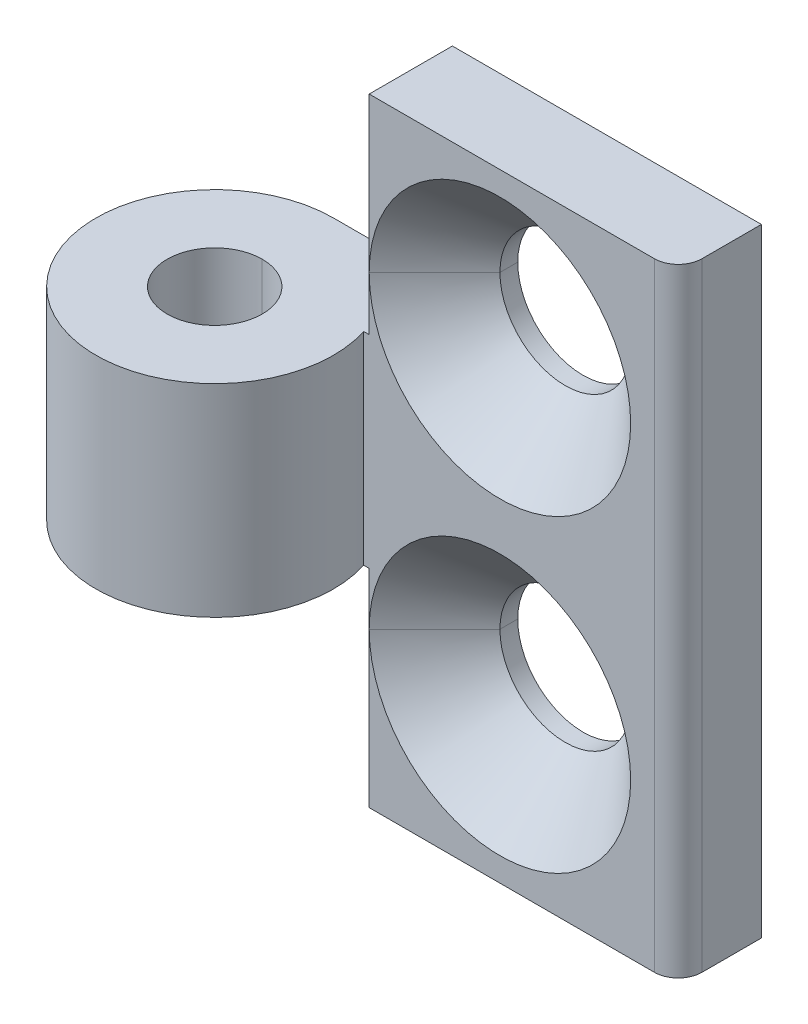
ISO-10303-21;
HEADER;
FILE_DESCRIPTION(('STEP AP214'),'2;1');
FILE_NAME('part.step','',(''),(''),'','','');
FILE_SCHEMA(('AUTOMOTIVE_DESIGN { 1 0 10303 214 1 1 1 1 }'));
ENDSEC;
DATA;
#1=APPLICATION_CONTEXT('core data for automotive mechanical design processes');
#2=APPLICATION_PROTOCOL_DEFINITION('international standard','automotive_design',2000,#1);
#3=PRODUCT_CONTEXT('',#1,'mechanical');
#4=PRODUCT('Part','Part','',(#3));
#5=PRODUCT_RELATED_PRODUCT_CATEGORY('part','',(#4));
#6=PRODUCT_DEFINITION_FORMATION('','',#4);
#7=PRODUCT_DEFINITION_CONTEXT('part definition',#1,'design');
#8=PRODUCT_DEFINITION('design','',#6,#7);
#9=PRODUCT_DEFINITION_SHAPE('','',#8);
#10=(LENGTH_UNIT() NAMED_UNIT(*) SI_UNIT(.MILLI.,.METRE.));
#11=(NAMED_UNIT(*) PLANE_ANGLE_UNIT() SI_UNIT($,.RADIAN.));
#12=(NAMED_UNIT(*) SI_UNIT($,.STERADIAN.) SOLID_ANGLE_UNIT());
#13=UNCERTAINTY_MEASURE_WITH_UNIT(LENGTH_MEASURE(1.E-05),#10,'distance_accuracy_value','');
#14=(GEOMETRIC_REPRESENTATION_CONTEXT(3) GLOBAL_UNCERTAINTY_ASSIGNED_CONTEXT((#13)) GLOBAL_UNIT_ASSIGNED_CONTEXT((#10,
#11,#12)) REPRESENTATION_CONTEXT('',''));
#15=CARTESIAN_POINT('',(0.,0.,0.));
#16=DIRECTION('',(0.,0.,1.));
#17=DIRECTION('',(1.,0.,0.));
#18=AXIS2_PLACEMENT_3D('',#15,#16,#17);
#19=CARTESIAN_POINT('',(0.,0.,-1.5));
#20=DIRECTION('',(0.,0.,1.));
#21=DIRECTION('',(1.,0.,0.));
#22=AXIS2_PLACEMENT_3D('',#19,#20,#21);
#23=PLANE('',#22);
#24=CARTESIAN_POINT('',(10.5,6.5,-1.5));
#25=DIRECTION('',(0.,0.,1.));
#26=DIRECTION('',(1.,0.,0.));
#27=AXIS2_PLACEMENT_3D('',#24,#25,#26);
#28=CIRCLE('',#27,5.5);
#29=CARTESIAN_POINT('',(16.,6.5,-1.5));
#30=VERTEX_POINT('',#29);
#31=CARTESIAN_POINT('',(5.,6.5,-1.5));
#32=VERTEX_POINT('',#31);
#33=EDGE_CURVE('E11',#30,#32,#28,.T.);
#34=ORIENTED_EDGE('',*,*,#33,.F.);
#35=CARTESIAN_POINT('',(10.5,6.5,-1.5));
#36=DIRECTION('',(0.,0.,1.));
#37=DIRECTION('',(1.,0.,0.));
#38=AXIS2_PLACEMENT_3D('',#35,#36,#37);
#39=CIRCLE('',#38,5.5);
#40=EDGE_CURVE('E25',#32,#30,#39,.T.);
#41=ORIENTED_EDGE('',*,*,#40,.F.);
#42=DIRECTION('',(0.,1.,0.));
#43=VECTOR('',#42,1.);
#44=CARTESIAN_POINT('',(5.,0.,-1.5));
#45=LINE('',#44,#43);
#46=CARTESIAN_POINT('',(5.,4.2333333333333,-1.5));
#47=VERTEX_POINT('',#46);
#48=EDGE_CURVE('E386',#47,#32,#45,.T.);
#49=ORIENTED_EDGE('',*,*,#48,.F.);
#50=DIRECTION('',(1.,0.,0.));
#51=VECTOR('',#50,1.);
#52=CARTESIAN_POINT('',(0.,4.2333333333333,-1.5));
#53=LINE('',#52,#51);
#54=CARTESIAN_POINT('',(4.76969600708473,4.2333333333333,-1.5));
#55=VERTEX_POINT('',#54);
#56=EDGE_CURVE('E381',#55,#47,#53,.T.);
#57=ORIENTED_EDGE('',*,*,#56,.F.);
#58=DIRECTION('',(0.,1.,0.));
#59=VECTOR('',#58,1.);
#60=CARTESIAN_POINT('',(4.76969600708473,-13.,-1.5));
#61=LINE('',#60,#59);
#62=CARTESIAN_POINT('',(4.76969600708473,-4.2833333333333,-1.5));
#63=VERTEX_POINT('',#62);
#64=EDGE_CURVE('E376',#63,#55,#61,.T.);
#65=ORIENTED_EDGE('',*,*,#64,.F.);
#66=DIRECTION('',(-1.,0.,0.));
#67=VECTOR('',#66,1.);
#68=CARTESIAN_POINT('',(0.,-4.2833333333333,-1.5));
#69=LINE('',#68,#67);
#70=CARTESIAN_POINT('',(5.,-4.2833333333333,-1.5));
#71=VERTEX_POINT('',#70);
#72=EDGE_CURVE('E371',#71,#63,#69,.T.);
#73=ORIENTED_EDGE('',*,*,#72,.F.);
#74=DIRECTION('',(0.,1.,0.));
#75=VECTOR('',#74,1.);
#76=CARTESIAN_POINT('',(5.,0.,-1.5));
#77=LINE('',#76,#75);
#78=CARTESIAN_POINT('',(5.,-6.5,-1.5));
#79=VERTEX_POINT('',#78);
#80=EDGE_CURVE('E366',#79,#71,#77,.T.);
#81=ORIENTED_EDGE('',*,*,#80,.F.);
#82=CARTESIAN_POINT('',(10.5,-6.5,-1.5));
#83=DIRECTION('',(0.,0.,1.));
#84=DIRECTION('',(1.,0.,0.));
#85=AXIS2_PLACEMENT_3D('',#82,#83,#84);
#86=CIRCLE('',#85,5.5);
#87=CARTESIAN_POINT('',(16.,-6.5,-1.5));
#88=VERTEX_POINT('',#87);
#89=EDGE_CURVE('E362',#88,#79,#86,.T.);
#90=ORIENTED_EDGE('',*,*,#89,.F.);
#91=CARTESIAN_POINT('',(10.5,-6.5,-1.5));
#92=DIRECTION('',(0.,0.,1.));
#93=DIRECTION('',(1.,0.,0.));
#94=AXIS2_PLACEMENT_3D('',#91,#92,#93);
#95=CIRCLE('',#94,5.5);
#96=EDGE_CURVE('E151',#79,#88,#95,.T.);
#97=ORIENTED_EDGE('',*,*,#96,.F.);
#98=DIRECTION('',(0.,1.,0.));
#99=VECTOR('',#98,1.);
#100=CARTESIAN_POINT('',(5.,0.,-1.5));
#101=LINE('',#100,#99);
#102=CARTESIAN_POINT('',(5.,-13.,-1.5));
#103=VERTEX_POINT('',#102);
#104=EDGE_CURVE('E354',#103,#79,#101,.T.);
#105=ORIENTED_EDGE('',*,*,#104,.F.);
#106=DIRECTION('',(1.,0.,0.));
#107=VECTOR('',#106,1.);
#108=CARTESIAN_POINT('',(0.,-13.,-1.5));
#109=LINE('',#108,#107);
#110=CARTESIAN_POINT('',(17.,-13.,-1.5));
#111=VERTEX_POINT('',#110);
#112=EDGE_CURVE('E350',#103,#111,#109,.T.);
#113=ORIENTED_EDGE('',*,*,#112,.T.);
#114=DIRECTION('',(0.,-1.,0.));
#115=VECTOR('',#114,1.);
#116=CARTESIAN_POINT('',(17.,13.,-1.5));
#117=LINE('',#116,#115);
#118=CARTESIAN_POINT('',(17.,13.,-1.5));
#119=VERTEX_POINT('',#118);
#120=EDGE_CURVE('E345',#119,#111,#117,.T.);
#121=ORIENTED_EDGE('',*,*,#120,.F.);
#122=DIRECTION('',(-1.,0.,0.));
#123=VECTOR('',#122,1.);
#124=CARTESIAN_POINT('',(18.,13.,-1.5));
#125=LINE('',#124,#123);
#126=CARTESIAN_POINT('',(5.,13.,-1.5));
#127=VERTEX_POINT('',#126);
#128=EDGE_CURVE('E341',#119,#127,#125,.T.);
#129=ORIENTED_EDGE('',*,*,#128,.T.);
#130=DIRECTION('',(0.,1.,0.));
#131=VECTOR('',#130,1.);
#132=CARTESIAN_POINT('',(5.,0.,-1.5));
#133=LINE('',#132,#131);
#134=EDGE_CURVE('E336',#32,#127,#133,.T.);
#135=ORIENTED_EDGE('',*,*,#134,.F.);
#136=EDGE_LOOP('',(#34,#41,#49,#57,#65,#73,#81,#90,#97,#105,#113,#121,#129,#135));
#137=FACE_BOUND('',#136,.T.);
#138=ADVANCED_FACE('F17',(#137),#23,.T.);
#139=CARTESIAN_POINT('',(5.,-4.2833333333333,21.));
#140=DIRECTION('',(1.,0.,0.));
#141=DIRECTION('',(0.,0.,-1.));
#142=AXIS2_PLACEMENT_3D('',#139,#140,#141);
#143=PLANE('',#142);
#144=ORIENTED_EDGE('',*,*,#104,.T.);
#145=ORIENTED_EDGE('',*,*,#80,.T.);
#146=DIRECTION('',(0.,0.,-1.));
#147=VECTOR('',#146,1.);
#148=CARTESIAN_POINT('',(5.,-4.2833333333333,21.));
#149=LINE('',#148,#147);
#150=CARTESIAN_POINT('',(5.,-4.2833333333333,-5.));
#151=VERTEX_POINT('',#150);
#152=EDGE_CURVE('E332',#71,#151,#149,.T.);
#153=ORIENTED_EDGE('',*,*,#152,.T.);
#154=DIRECTION('',(0.,-1.,0.));
#155=VECTOR('',#154,1.);
#156=CARTESIAN_POINT('',(5.,-4.2833333333333,-5.));
#157=LINE('',#156,#155);
#158=CARTESIAN_POINT('',(5.,-13.,-5.));
#159=VERTEX_POINT('',#158);
#160=EDGE_CURVE('E328',#151,#159,#157,.T.);
#161=ORIENTED_EDGE('',*,*,#160,.T.);
#162=DIRECTION('',(0.,0.,-1.));
#163=VECTOR('',#162,1.);
#164=CARTESIAN_POINT('',(5.,-13.,21.));
#165=LINE('',#164,#163);
#166=EDGE_CURVE('E323',#103,#159,#165,.T.);
#167=ORIENTED_EDGE('',*,*,#166,.F.);
#168=EDGE_LOOP('',(#144,#145,#153,#161,#167));
#169=FACE_BOUND('',#168,.T.);
#170=ADVANCED_FACE('F418',(#169),#143,.F.);
#171=CARTESIAN_POINT('',(5.,-13.,0.));
#172=DIRECTION('',(0.,1.,0.));
#173=DIRECTION('',(0.,0.,1.));
#174=AXIS2_PLACEMENT_3D('',#171,#172,#173);
#175=PLANE('',#174);
#176=DIRECTION('',(0.,0.,-1.));
#177=VECTOR('',#176,1.);
#178=CARTESIAN_POINT('',(18.,-13.,-1.5));
#179=LINE('',#178,#177);
#180=CARTESIAN_POINT('',(18.,-13.,-2.5));
#181=VERTEX_POINT('',#180);
#182=CARTESIAN_POINT('',(18.,-13.,-5.));
#183=VERTEX_POINT('',#182);
#184=EDGE_CURVE('E318',#181,#183,#179,.T.);
#185=ORIENTED_EDGE('',*,*,#184,.F.);
#186=CARTESIAN_POINT('',(17.0000000000007,-13.,-2.49999999999931));
#187=DIRECTION('',(0.,1.,0.));
#188=DIRECTION('',(1.,0.,0.));
#189=AXIS2_PLACEMENT_3D('',#186,#187,#188);
#190=CIRCLE('',#189,0.99999999999931);
#191=EDGE_CURVE('E313',#111,#181,#190,.T.);
#192=ORIENTED_EDGE('',*,*,#191,.F.);
#193=ORIENTED_EDGE('',*,*,#112,.F.);
#194=ORIENTED_EDGE('',*,*,#166,.T.);
#195=DIRECTION('',(1.,0.,0.));
#196=VECTOR('',#195,1.);
#197=CARTESIAN_POINT('',(0.,-13.,-5.));
#198=LINE('',#197,#196);
#199=EDGE_CURVE('E309',#159,#183,#198,.T.);
#200=ORIENTED_EDGE('',*,*,#199,.T.);
#201=EDGE_LOOP('',(#185,#192,#193,#194,#200));
#202=FACE_BOUND('',#201,.T.);
#203=ADVANCED_FACE('F429',(#202),#175,.F.);
#204=CARTESIAN_POINT('',(0.,0.,-5.));
#205=DIRECTION('',(0.,0.,1.));
#206=DIRECTION('',(1.,0.,0.));
#207=AXIS2_PLACEMENT_3D('',#204,#205,#206);
#208=PLANE('',#207);
#209=CARTESIAN_POINT('',(10.5,-6.5,-5.));
#210=DIRECTION('',(0.,0.,1.));
#211=DIRECTION('',(1.,0.,0.));
#212=AXIS2_PLACEMENT_3D('',#209,#210,#211);
#213=CIRCLE('',#212,2.75);
#214=CARTESIAN_POINT('',(13.25,-6.5,-5.));
#215=VERTEX_POINT('',#214);
#216=CARTESIAN_POINT('',(7.75,-6.5,-5.));
#217=VERTEX_POINT('',#216);
#218=EDGE_CURVE('E163',#215,#217,#213,.T.);
#219=ORIENTED_EDGE('',*,*,#218,.T.);
#220=CARTESIAN_POINT('',(10.5,-6.5,-5.));
#221=DIRECTION('',(0.,0.,1.));
#222=DIRECTION('',(1.,0.,0.));
#223=AXIS2_PLACEMENT_3D('',#220,#221,#222);
#224=CIRCLE('',#223,2.75);
#225=EDGE_CURVE('E302',#217,#215,#224,.T.);
#226=ORIENTED_EDGE('',*,*,#225,.T.);
#227=EDGE_LOOP('',(#219,#226));
#228=FACE_BOUND('',#227,.T.);
#229=CARTESIAN_POINT('',(10.5,6.5,-5.));
#230=DIRECTION('',(0.,0.,1.));
#231=DIRECTION('',(1.,0.,0.));
#232=AXIS2_PLACEMENT_3D('',#229,#230,#231);
#233=CIRCLE('',#232,2.75);
#234=CARTESIAN_POINT('',(13.25,6.5,-5.));
#235=VERTEX_POINT('',#234);
#236=CARTESIAN_POINT('',(7.75,6.5,-5.));
#237=VERTEX_POINT('',#236);
#238=EDGE_CURVE('E298',#235,#237,#233,.T.);
#239=ORIENTED_EDGE('',*,*,#238,.T.);
#240=CARTESIAN_POINT('',(10.5,6.5,-5.));
#241=DIRECTION('',(0.,0.,1.));
#242=DIRECTION('',(1.,0.,0.));
#243=AXIS2_PLACEMENT_3D('',#240,#241,#242);
#244=CIRCLE('',#243,2.75);
#245=EDGE_CURVE('E294',#237,#235,#244,.T.);
#246=ORIENTED_EDGE('',*,*,#245,.T.);
#247=EDGE_LOOP('',(#239,#246));
#248=FACE_BOUND('',#247,.T.);
#249=DIRECTION('',(0.,-1.,0.));
#250=VECTOR('',#249,1.);
#251=CARTESIAN_POINT('',(0.,13.,-5.));
#252=LINE('',#251,#250);
#253=CARTESIAN_POINT('',(0.,4.2333333333333,-5.));
#254=VERTEX_POINT('',#253);
#255=CARTESIAN_POINT('',(0.,-4.2833333333333,-5.));
#256=VERTEX_POINT('',#255);
#257=EDGE_CURVE('E289',#254,#256,#252,.T.);
#258=ORIENTED_EDGE('',*,*,#257,.F.);
#259=DIRECTION('',(-1.,0.,0.));
#260=VECTOR('',#259,1.);
#261=CARTESIAN_POINT('',(5.,4.2333333333333,-5.));
#262=LINE('',#261,#260);
#263=CARTESIAN_POINT('',(5.,4.2333333333333,-5.));
#264=VERTEX_POINT('',#263);
#265=EDGE_CURVE('E284',#264,#254,#262,.T.);
#266=ORIENTED_EDGE('',*,*,#265,.F.);
#267=DIRECTION('',(0.,-1.,0.));
#268=VECTOR('',#267,1.);
#269=CARTESIAN_POINT('',(5.,13.,-5.));
#270=LINE('',#269,#268);
#271=CARTESIAN_POINT('',(5.,13.,-5.));
#272=VERTEX_POINT('',#271);
#273=EDGE_CURVE('E279',#272,#264,#270,.T.);
#274=ORIENTED_EDGE('',*,*,#273,.F.);
#275=DIRECTION('',(-1.,0.,0.));
#276=VECTOR('',#275,1.);
#277=CARTESIAN_POINT('',(18.,13.,-5.));
#278=LINE('',#277,#276);
#279=CARTESIAN_POINT('',(18.,13.,-5.));
#280=VERTEX_POINT('',#279);
#281=EDGE_CURVE('E274',#280,#272,#278,.T.);
#282=ORIENTED_EDGE('',*,*,#281,.F.);
#283=DIRECTION('',(0.,1.,0.));
#284=VECTOR('',#283,1.);
#285=CARTESIAN_POINT('',(18.,-13.,-5.));
#286=LINE('',#285,#284);
#287=EDGE_CURVE('E269',#183,#280,#286,.T.);
#288=ORIENTED_EDGE('',*,*,#287,.F.);
#289=ORIENTED_EDGE('',*,*,#199,.F.);
#290=ORIENTED_EDGE('',*,*,#160,.F.);
#291=DIRECTION('',(1.,0.,0.));
#292=VECTOR('',#291,1.);
#293=CARTESIAN_POINT('',(-5.,-4.2833333333333,-5.));
#294=LINE('',#293,#292);
#295=EDGE_CURVE('E264',#256,#151,#294,.T.);
#296=ORIENTED_EDGE('',*,*,#295,.F.);
#297=EDGE_LOOP('',(#258,#266,#274,#282,#288,#289,#290,#296));
#298=FACE_BOUND('',#297,.T.);
#299=ADVANCED_FACE('F439',(#228,#248,#298),#208,.F.);
#300=CARTESIAN_POINT('',(-5.,-4.2833333333333,21.));
#301=DIRECTION('',(0.,1.,0.));
#302=DIRECTION('',(0.,0.,1.));
#303=AXIS2_PLACEMENT_3D('',#300,#301,#302);
#304=PLANE('',#303);
#305=CARTESIAN_POINT('',(0.,-4.2833333333333,0.));
#306=DIRECTION('',(0.,-1.,0.));
#307=DIRECTION('',(0.,0.,1.));
#308=AXIS2_PLACEMENT_3D('',#305,#306,#307);
#309=CIRCLE('',#308,2.);
#310=CARTESIAN_POINT('',(0.,-4.2833333333333,-2.));
#311=VERTEX_POINT('',#310);
#312=CARTESIAN_POINT('',(0.,-4.2833333333333,2.));
#313=VERTEX_POINT('',#312);
#314=EDGE_CURVE('E259',#311,#313,#309,.T.);
#315=ORIENTED_EDGE('',*,*,#314,.F.);
#316=CARTESIAN_POINT('',(0.,-4.2833333333333,0.));
#317=DIRECTION('',(0.,-1.,0.));
#318=DIRECTION('',(0.,0.,1.));
#319=AXIS2_PLACEMENT_3D('',#316,#317,#318);
#320=CIRCLE('',#319,2.);
#321=EDGE_CURVE('E254',#313,#311,#320,.T.);
#322=ORIENTED_EDGE('',*,*,#321,.F.);
#323=EDGE_LOOP('',(#315,#322));
#324=FACE_BOUND('',#323,.T.);
#325=ORIENTED_EDGE('',*,*,#295,.T.);
#326=ORIENTED_EDGE('',*,*,#152,.F.);
#327=ORIENTED_EDGE('',*,*,#72,.T.);
#328=CARTESIAN_POINT('',(0.,-4.2833333333333,0.));
#329=DIRECTION('',(0.,1.,0.));
#330=DIRECTION('',(0.,0.,1.));
#331=AXIS2_PLACEMENT_3D('',#328,#329,#330);
#332=CIRCLE('',#331,5.);
#333=EDGE_CURVE('E249',#256,#63,#332,.T.);
#334=ORIENTED_EDGE('',*,*,#333,.F.);
#335=EDGE_LOOP('',(#325,#326,#327,#334));
#336=FACE_BOUND('',#335,.T.);
#337=ADVANCED_FACE('F415',(#324,#336),#304,.F.);
#338=CARTESIAN_POINT('',(0.,-13.,0.));
#339=DIRECTION('',(0.,-1.,0.));
#340=DIRECTION('',(0.591607972515193,0.,-0.806225779082053));
#341=AXIS2_PLACEMENT_3D('',#338,#339,#340);
#342=CYLINDRICAL_SURFACE('',#341,5.);
#343=ORIENTED_EDGE('',*,*,#257,.T.);
#344=ORIENTED_EDGE('',*,*,#333,.T.);
#345=ORIENTED_EDGE('',*,*,#64,.T.);
#346=CARTESIAN_POINT('',(0.,4.2333333333333,0.));
#347=DIRECTION('',(0.,-1.,0.));
#348=DIRECTION('',(0.,0.,-1.));
#349=AXIS2_PLACEMENT_3D('',#346,#347,#348);
#350=CIRCLE('',#349,5.);
#351=EDGE_CURVE('E244',#55,#254,#350,.T.);
#352=ORIENTED_EDGE('',*,*,#351,.T.);
#353=EDGE_LOOP('',(#343,#344,#345,#352));
#354=FACE_BOUND('',#353,.T.);
#355=ADVANCED_FACE('F411',(#354),#342,.T.);
#356=CARTESIAN_POINT('',(5.,4.2333333333333,21.));
#357=DIRECTION('',(0.,-1.,0.));
#358=DIRECTION('',(0.,0.,-1.));
#359=AXIS2_PLACEMENT_3D('',#356,#357,#358);
#360=PLANE('',#359);
#361=CARTESIAN_POINT('',(0.,4.2333333333333,0.));
#362=DIRECTION('',(0.,1.,0.));
#363=DIRECTION('',(0.,0.,-1.));
#364=AXIS2_PLACEMENT_3D('',#361,#362,#363);
#365=CIRCLE('',#364,2.);
#366=CARTESIAN_POINT('',(0.,4.2333333333333,2.));
#367=VERTEX_POINT('',#366);
#368=CARTESIAN_POINT('',(0.,4.2333333333333,-2.));
#369=VERTEX_POINT('',#368);
#370=EDGE_CURVE('E239',#367,#369,#365,.T.);
#371=ORIENTED_EDGE('',*,*,#370,.F.);
#372=CARTESIAN_POINT('',(0.,4.2333333333333,0.));
#373=DIRECTION('',(0.,1.,0.));
#374=DIRECTION('',(0.,0.,-1.));
#375=AXIS2_PLACEMENT_3D('',#372,#373,#374);
#376=CIRCLE('',#375,2.);
#377=EDGE_CURVE('E234',#369,#367,#376,.T.);
#378=ORIENTED_EDGE('',*,*,#377,.F.);
#379=EDGE_LOOP('',(#371,#378));
#380=FACE_BOUND('',#379,.T.);
#381=ORIENTED_EDGE('',*,*,#351,.F.);
#382=ORIENTED_EDGE('',*,*,#56,.T.);
#383=DIRECTION('',(0.,0.,-1.));
#384=VECTOR('',#383,1.);
#385=CARTESIAN_POINT('',(5.,4.2333333333333,21.));
#386=LINE('',#385,#384);
#387=EDGE_CURVE('E229',#47,#264,#386,.T.);
#388=ORIENTED_EDGE('',*,*,#387,.T.);
#389=ORIENTED_EDGE('',*,*,#265,.T.);
#390=EDGE_LOOP('',(#381,#382,#388,#389));
#391=FACE_BOUND('',#390,.T.);
#392=ADVANCED_FACE('F409',(#380,#391),#360,.F.);
#393=CARTESIAN_POINT('',(5.,13.,21.));
#394=DIRECTION('',(1.,0.,0.));
#395=DIRECTION('',(0.,0.,-1.));
#396=AXIS2_PLACEMENT_3D('',#393,#394,#395);
#397=PLANE('',#396);
#398=ORIENTED_EDGE('',*,*,#48,.T.);
#399=ORIENTED_EDGE('',*,*,#134,.T.);
#400=DIRECTION('',(0.,0.,-1.));
#401=VECTOR('',#400,1.);
#402=CARTESIAN_POINT('',(5.,13.,21.));
#403=LINE('',#402,#401);
#404=EDGE_CURVE('E224',#127,#272,#403,.T.);
#405=ORIENTED_EDGE('',*,*,#404,.T.);
#406=ORIENTED_EDGE('',*,*,#273,.T.);
#407=ORIENTED_EDGE('',*,*,#387,.F.);
#408=EDGE_LOOP('',(#398,#399,#405,#406,#407));
#409=FACE_BOUND('',#408,.T.);
#410=ADVANCED_FACE('F405',(#409),#397,.F.);
#411=CARTESIAN_POINT('',(0.,13.,0.));
#412=DIRECTION('',(0.,-1.,0.));
#413=DIRECTION('',(0.,0.,-1.));
#414=AXIS2_PLACEMENT_3D('',#411,#412,#413);
#415=PLANE('',#414);
#416=ORIENTED_EDGE('',*,*,#128,.F.);
#417=CARTESIAN_POINT('',(17.0000000000007,13.,-2.49999999999931));
#418=DIRECTION('',(0.,1.,0.));
#419=DIRECTION('',(1.,0.,0.));
#420=AXIS2_PLACEMENT_3D('',#417,#418,#419);
#421=CIRCLE('',#420,0.99999999999931);
#422=CARTESIAN_POINT('',(18.,13.,-2.5));
#423=VERTEX_POINT('',#422);
#424=EDGE_CURVE('E220',#119,#423,#421,.T.);
#425=ORIENTED_EDGE('',*,*,#424,.T.);
#426=DIRECTION('',(0.,0.,-1.));
#427=VECTOR('',#426,1.);
#428=CARTESIAN_POINT('',(18.,13.,-1.5));
#429=LINE('',#428,#427);
#430=EDGE_CURVE('E215',#423,#280,#429,.T.);
#431=ORIENTED_EDGE('',*,*,#430,.T.);
#432=ORIENTED_EDGE('',*,*,#281,.T.);
#433=ORIENTED_EDGE('',*,*,#404,.F.);
#434=EDGE_LOOP('',(#416,#425,#431,#432,#433));
#435=FACE_BOUND('',#434,.T.);
#436=ADVANCED_FACE('F436',(#435),#415,.F.);
#437=CARTESIAN_POINT('',(18.,-13.,-1.5));
#438=DIRECTION('',(-1.,0.,0.));
#439=DIRECTION('',(0.,0.,1.));
#440=AXIS2_PLACEMENT_3D('',#437,#438,#439);
#441=PLANE('',#440);
#442=DIRECTION('',(0.,-1.,0.));
#443=VECTOR('',#442,1.);
#444=CARTESIAN_POINT('',(18.,13.,-2.5));
#445=LINE('',#444,#443);
#446=EDGE_CURVE('E210',#423,#181,#445,.T.);
#447=ORIENTED_EDGE('',*,*,#446,.T.);
#448=ORIENTED_EDGE('',*,*,#184,.T.);
#449=ORIENTED_EDGE('',*,*,#287,.T.);
#450=ORIENTED_EDGE('',*,*,#430,.F.);
#451=EDGE_LOOP('',(#447,#448,#449,#450));
#452=FACE_BOUND('',#451,.T.);
#453=ADVANCED_FACE('F441',(#452),#441,.F.);
#454=CARTESIAN_POINT('',(17.0000000000007,13.,-2.49999999999931));
#455=DIRECTION('',(0.,-1.,0.));
#456=DIRECTION('',(-0.70710678118846,0.,-0.707106781184635));
#457=AXIS2_PLACEMENT_3D('',#454,#455,#456);
#458=CYLINDRICAL_SURFACE('',#457,0.99999999999931);
#459=ORIENTED_EDGE('',*,*,#191,.T.);
#460=ORIENTED_EDGE('',*,*,#446,.F.);
#461=ORIENTED_EDGE('',*,*,#424,.F.);
#462=ORIENTED_EDGE('',*,*,#120,.T.);
#463=EDGE_LOOP('',(#459,#460,#461,#462));
#464=FACE_BOUND('',#463,.T.);
#465=ADVANCED_FACE('F433',(#464),#458,.T.);
#466=CARTESIAN_POINT('',(0.,-16.2,0.));
#467=DIRECTION('',(0.,-1.,0.));
#468=DIRECTION('',(1.,0.,0.));
#469=AXIS2_PLACEMENT_3D('',#466,#467,#468);
#470=CYLINDRICAL_SURFACE('',#469,2.);
#471=DIRECTION('',(0.,-1.,0.));
#472=VECTOR('',#471,1.);
#473=CARTESIAN_POINT('',(0.,4.2333333333333,2.));
#474=LINE('',#473,#472);
#475=EDGE_CURVE('E205',#367,#313,#474,.T.);
#476=ORIENTED_EDGE('',*,*,#475,.T.);
#477=ORIENTED_EDGE('',*,*,#321,.T.);
#478=DIRECTION('',(0.,-1.,0.));
#479=VECTOR('',#478,1.);
#480=CARTESIAN_POINT('',(0.,4.2333333333333,-2.));
#481=LINE('',#480,#479);
#482=EDGE_CURVE('E200',#369,#311,#481,.T.);
#483=ORIENTED_EDGE('',*,*,#482,.F.);
#484=ORIENTED_EDGE('',*,*,#377,.T.);
#485=EDGE_LOOP('',(#476,#477,#483,#484));
#486=FACE_BOUND('',#485,.T.);
#487=ADVANCED_FACE('F449',(#486),#470,.F.);
#488=CARTESIAN_POINT('',(0.,-16.2,0.));
#489=DIRECTION('',(0.,-1.,0.));
#490=DIRECTION('',(-1.,0.,0.));
#491=AXIS2_PLACEMENT_3D('',#488,#489,#490);
#492=CYLINDRICAL_SURFACE('',#491,2.);
#493=ORIENTED_EDGE('',*,*,#475,.F.);
#494=ORIENTED_EDGE('',*,*,#370,.T.);
#495=ORIENTED_EDGE('',*,*,#482,.T.);
#496=ORIENTED_EDGE('',*,*,#314,.T.);
#497=EDGE_LOOP('',(#493,#494,#495,#496));
#498=FACE_BOUND('',#497,.T.);
#499=ADVANCED_FACE('F508',(#498),#492,.F.);
#500=CARTESIAN_POINT('',(10.5,6.5,-1.5));
#501=DIRECTION('',(0.,0.,1.));
#502=DIRECTION('',(0.,1.,0.));
#503=AXIS2_PLACEMENT_3D('',#500,#501,#502);
#504=CYLINDRICAL_SURFACE('',#503,2.75);
#505=DIRECTION('',(0.,0.,1.));
#506=VECTOR('',#505,1.);
#507=CARTESIAN_POINT('',(7.75,6.5,-5.));
#508=LINE('',#507,#506);
#509=CARTESIAN_POINT('',(7.75,6.5,-4.25));
#510=VERTEX_POINT('',#509);
#511=EDGE_CURVE('E196',#237,#510,#508,.T.);
#512=ORIENTED_EDGE('',*,*,#511,.T.);
#513=CARTESIAN_POINT('',(10.5,6.5,-4.25));
#514=DIRECTION('',(0.,0.,1.));
#515=DIRECTION('',(1.,0.,0.));
#516=AXIS2_PLACEMENT_3D('',#513,#514,#515);
#517=CIRCLE('',#516,2.75);
#518=CARTESIAN_POINT('',(13.25,6.5,-4.25));
#519=VERTEX_POINT('',#518);
#520=EDGE_CURVE('E192',#510,#519,#517,.T.);
#521=ORIENTED_EDGE('',*,*,#520,.T.);
#522=DIRECTION('',(0.,0.,1.));
#523=VECTOR('',#522,1.);
#524=CARTESIAN_POINT('',(13.25,6.5,-5.));
#525=LINE('',#524,#523);
#526=EDGE_CURVE('E187',#235,#519,#525,.T.);
#527=ORIENTED_EDGE('',*,*,#526,.F.);
#528=ORIENTED_EDGE('',*,*,#245,.F.);
#529=EDGE_LOOP('',(#512,#521,#527,#528));
#530=FACE_BOUND('',#529,.T.);
#531=ADVANCED_FACE('F519',(#530),#504,.F.);
#532=CARTESIAN_POINT('',(10.5,6.5,-1.5));
#533=DIRECTION('',(0.,0.,1.));
#534=DIRECTION('',(0.,-1.,0.));
#535=AXIS2_PLACEMENT_3D('',#532,#533,#534);
#536=CYLINDRICAL_SURFACE('',#535,2.75);
#537=ORIENTED_EDGE('',*,*,#511,.F.);
#538=ORIENTED_EDGE('',*,*,#238,.F.);
#539=ORIENTED_EDGE('',*,*,#526,.T.);
#540=CARTESIAN_POINT('',(10.5,6.5,-4.25));
#541=DIRECTION('',(0.,0.,1.));
#542=DIRECTION('',(1.,0.,0.));
#543=AXIS2_PLACEMENT_3D('',#540,#541,#542);
#544=CIRCLE('',#543,2.75);
#545=EDGE_CURVE('E182',#519,#510,#544,.T.);
#546=ORIENTED_EDGE('',*,*,#545,.T.);
#547=EDGE_LOOP('',(#537,#538,#539,#546));
#548=FACE_BOUND('',#547,.T.);
#549=ADVANCED_FACE('F530',(#548),#536,.F.);
#550=CARTESIAN_POINT('',(10.5,6.5,-4.25));
#551=DIRECTION('',(0.,0.,1.));
#552=DIRECTION('',(0.,-1.,0.));
#553=AXIS2_PLACEMENT_3D('',#550,#551,#552);
#554=CONICAL_SURFACE('',#553,2.75,0.785398163397448);
#555=DIRECTION('',(-0.707106781186547,0.,0.707106781186548));
#556=VECTOR('',#555,1.);
#557=CARTESIAN_POINT('',(7.75,6.5,-4.25));
#558=LINE('',#557,#556);
#559=EDGE_CURVE('E177',#510,#32,#558,.T.);
#560=ORIENTED_EDGE('',*,*,#559,.F.);
#561=ORIENTED_EDGE('',*,*,#545,.F.);
#562=DIRECTION('',(0.707106781186548,0.,0.707106781186548));
#563=VECTOR('',#562,1.);
#564=CARTESIAN_POINT('',(13.25,6.5,-4.25));
#565=LINE('',#564,#563);
#566=EDGE_CURVE('E173',#519,#30,#565,.T.);
#567=ORIENTED_EDGE('',*,*,#566,.T.);
#568=ORIENTED_EDGE('',*,*,#33,.T.);
#569=EDGE_LOOP('',(#560,#561,#567,#568));
#570=FACE_BOUND('',#569,.T.);
#571=ADVANCED_FACE('F401',(#570),#554,.F.);
#572=CARTESIAN_POINT('',(10.5,6.5,-4.25));
#573=DIRECTION('',(0.,0.,1.));
#574=DIRECTION('',(0.,1.,0.));
#575=AXIS2_PLACEMENT_3D('',#572,#573,#574);
#576=CONICAL_SURFACE('',#575,2.75,0.785398163397448);
#577=ORIENTED_EDGE('',*,*,#559,.T.);
#578=ORIENTED_EDGE('',*,*,#40,.T.);
#579=ORIENTED_EDGE('',*,*,#566,.F.);
#580=ORIENTED_EDGE('',*,*,#520,.F.);
#581=EDGE_LOOP('',(#577,#578,#579,#580));
#582=FACE_BOUND('',#581,.T.);
#583=ADVANCED_FACE('F396',(#582),#576,.F.);
#584=CARTESIAN_POINT('',(10.5,-6.5,-1.5));
#585=DIRECTION('',(0.,0.,1.));
#586=DIRECTION('',(0.,1.,0.));
#587=AXIS2_PLACEMENT_3D('',#584,#585,#586);
#588=CYLINDRICAL_SURFACE('',#587,2.75);
#589=DIRECTION('',(0.,0.,1.));
#590=VECTOR('',#589,1.);
#591=CARTESIAN_POINT('',(7.75,-6.5,-5.));
#592=LINE('',#591,#590);
#593=CARTESIAN_POINT('',(7.75,-6.5,-4.25));
#594=VERTEX_POINT('',#593);
#595=EDGE_CURVE('E140',#217,#594,#592,.T.);
#596=ORIENTED_EDGE('',*,*,#595,.T.);
#597=CARTESIAN_POINT('',(10.5,-6.5,-4.25));
#598=DIRECTION('',(0.,0.,1.));
#599=DIRECTION('',(1.,0.,0.));
#600=AXIS2_PLACEMENT_3D('',#597,#598,#599);
#601=CIRCLE('',#600,2.75);
#602=CARTESIAN_POINT('',(13.25,-6.5,-4.25));
#603=VERTEX_POINT('',#602);
#604=EDGE_CURVE('E133',#594,#603,#601,.T.);
#605=ORIENTED_EDGE('',*,*,#604,.T.);
#606=DIRECTION('',(0.,0.,1.));
#607=VECTOR('',#606,1.);
#608=CARTESIAN_POINT('',(13.25,-6.5,-5.));
#609=LINE('',#608,#607);
#610=EDGE_CURVE('E138',#215,#603,#609,.T.);
#611=ORIENTED_EDGE('',*,*,#610,.F.);
#612=ORIENTED_EDGE('',*,*,#225,.F.);
#613=EDGE_LOOP('',(#596,#605,#611,#612));
#614=FACE_BOUND('',#613,.T.);
#615=ADVANCED_FACE('F135',(#614),#588,.F.);
#616=CARTESIAN_POINT('',(10.5,-6.5,-1.5));
#617=DIRECTION('',(0.,0.,1.));
#618=DIRECTION('',(0.,-1.,0.));
#619=AXIS2_PLACEMENT_3D('',#616,#617,#618);
#620=CYLINDRICAL_SURFACE('',#619,2.75);
#621=ORIENTED_EDGE('',*,*,#595,.F.);
#622=ORIENTED_EDGE('',*,*,#218,.F.);
#623=ORIENTED_EDGE('',*,*,#610,.T.);
#624=CARTESIAN_POINT('',(10.5,-6.5,-4.25));
#625=DIRECTION('',(0.,0.,1.));
#626=DIRECTION('',(1.,0.,0.));
#627=AXIS2_PLACEMENT_3D('',#624,#625,#626);
#628=CIRCLE('',#627,2.75);
#629=EDGE_CURVE('E157',#603,#594,#628,.T.);
#630=ORIENTED_EDGE('',*,*,#629,.T.);
#631=EDGE_LOOP('',(#621,#622,#623,#630));
#632=FACE_BOUND('',#631,.T.);
#633=ADVANCED_FACE('F162',(#632),#620,.F.);
#634=CARTESIAN_POINT('',(10.5,-6.5,-4.25));
#635=DIRECTION('',(0.,0.,1.));
#636=DIRECTION('',(0.,-1.,0.));
#637=AXIS2_PLACEMENT_3D('',#634,#635,#636);
#638=CONICAL_SURFACE('',#637,2.75,0.785398163397448);
#639=DIRECTION('',(-0.707106781186547,0.,0.707106781186548));
#640=VECTOR('',#639,1.);
#641=CARTESIAN_POINT('',(7.75,-6.5,-4.25));
#642=LINE('',#641,#640);
#643=EDGE_CURVE('E154',#594,#79,#642,.T.);
#644=ORIENTED_EDGE('',*,*,#643,.F.);
#645=ORIENTED_EDGE('',*,*,#629,.F.);
#646=DIRECTION('',(0.707106781186547,0.,0.707106781186548));
#647=VECTOR('',#646,1.);
#648=CARTESIAN_POINT('',(13.25,-6.5,-4.25));
#649=LINE('',#648,#647);
#650=EDGE_CURVE('E147',#603,#88,#649,.T.);
#651=ORIENTED_EDGE('',*,*,#650,.T.);
#652=ORIENTED_EDGE('',*,*,#89,.T.);
#653=EDGE_LOOP('',(#644,#645,#651,#652));
#654=FACE_BOUND('',#653,.T.);
#655=ADVANCED_FACE('F158',(#654),#638,.F.);
#656=CARTESIAN_POINT('',(10.5,-6.5,-4.25));
#657=DIRECTION('',(0.,0.,1.));
#658=DIRECTION('',(0.,1.,0.));
#659=AXIS2_PLACEMENT_3D('',#656,#657,#658);
#660=CONICAL_SURFACE('',#659,2.75,0.785398163397448);
#661=ORIENTED_EDGE('',*,*,#643,.T.);
#662=ORIENTED_EDGE('',*,*,#96,.T.);
#663=ORIENTED_EDGE('',*,*,#650,.F.);
#664=ORIENTED_EDGE('',*,*,#604,.F.);
#665=EDGE_LOOP('',(#661,#662,#663,#664));
#666=FACE_BOUND('',#665,.T.);
#667=ADVANCED_FACE('F149',(#666),#660,.F.);
#668=CLOSED_SHELL('',(#138,#170,#203,#299,#337,#355,#392,#410,#436,#453,#465,#487,#499,#531,
#549,#571,#583,#615,#633,#655,#667));
#669=MANIFOLD_SOLID_BREP('B1',#668);
#670=ADVANCED_BREP_SHAPE_REPRESENTATION('',(#18,#669),#14);
#671=SHAPE_DEFINITION_REPRESENTATION(#9,#670);
ENDSEC;
END-ISO-10303-21;
